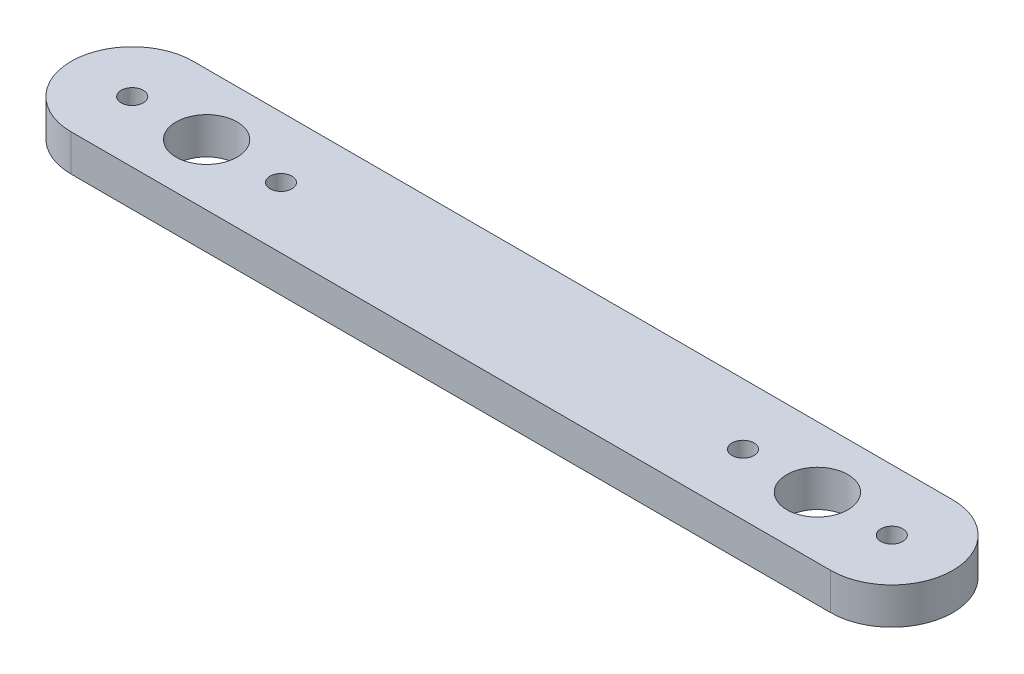
ISO-10303-21;
HEADER;
FILE_DESCRIPTION(('STEP AP214'),'2;1');
FILE_NAME('part.step','',(''),(''),'','','');
FILE_SCHEMA(('AUTOMOTIVE_DESIGN { 1 0 10303 214 1 1 1 1 }'));
ENDSEC;
DATA;
#1=APPLICATION_CONTEXT('core data for automotive mechanical design processes');
#2=APPLICATION_PROTOCOL_DEFINITION('international standard','automotive_design',2000,#1);
#3=PRODUCT_CONTEXT('',#1,'mechanical');
#4=PRODUCT('Part','Part','',(#3));
#5=PRODUCT_RELATED_PRODUCT_CATEGORY('part','',(#4));
#6=PRODUCT_DEFINITION_FORMATION('','',#4);
#7=PRODUCT_DEFINITION_CONTEXT('part definition',#1,'design');
#8=PRODUCT_DEFINITION('design','',#6,#7);
#9=PRODUCT_DEFINITION_SHAPE('','',#8);
#10=(LENGTH_UNIT() NAMED_UNIT(*) SI_UNIT(.MILLI.,.METRE.));
#11=(NAMED_UNIT(*) PLANE_ANGLE_UNIT() SI_UNIT($,.RADIAN.));
#12=(NAMED_UNIT(*) SI_UNIT($,.STERADIAN.) SOLID_ANGLE_UNIT());
#13=UNCERTAINTY_MEASURE_WITH_UNIT(LENGTH_MEASURE(1.E-05),#10,'distance_accuracy_value','');
#14=(GEOMETRIC_REPRESENTATION_CONTEXT(3) GLOBAL_UNCERTAINTY_ASSIGNED_CONTEXT((#13)) GLOBAL_UNIT_ASSIGNED_CONTEXT((#10,
#11,#12)) REPRESENTATION_CONTEXT('',''));
#15=CARTESIAN_POINT('',(0.,0.,0.));
#16=DIRECTION('',(0.,0.,1.));
#17=DIRECTION('',(1.,0.,0.));
#18=AXIS2_PLACEMENT_3D('',#15,#16,#17);
#19=CARTESIAN_POINT('',(-31.09,3.,0.));
#20=DIRECTION('',(0.,1.,0.));
#21=DIRECTION('',(0.,0.,1.));
#22=AXIS2_PLACEMENT_3D('',#19,#20,#21);
#23=PLANE('',#22);
#24=CARTESIAN_POINT('',(-31.09,3.,0.));
#25=DIRECTION('',(0.,1.,0.));
#26=DIRECTION('',(0.,0.,1.));
#27=AXIS2_PLACEMENT_3D('',#24,#25,#26);
#28=CIRCLE('',#27,0.9);
#29=CARTESIAN_POINT('',(-31.09,3.,0.900000000000001));
#30=VERTEX_POINT('',#29);
#31=EDGE_CURVE('E158',#30,#30,#28,.T.);
#32=ORIENTED_EDGE('',*,*,#31,.F.);
#33=EDGE_LOOP('',(#32));
#34=FACE_BOUND('',#33,.T.);
#35=CARTESIAN_POINT('',(-18.91,3.,0.));
#36=DIRECTION('',(0.,1.,0.));
#37=DIRECTION('',(0.,0.,1.));
#38=AXIS2_PLACEMENT_3D('',#35,#36,#37);
#39=CIRCLE('',#38,0.9);
#40=CARTESIAN_POINT('',(-18.91,3.,0.9));
#41=VERTEX_POINT('',#40);
#42=EDGE_CURVE('E142',#41,#41,#39,.T.);
#43=ORIENTED_EDGE('',*,*,#42,.F.);
#44=EDGE_LOOP('',(#43));
#45=FACE_BOUND('',#44,.T.);
#46=CARTESIAN_POINT('',(-25.,3.,0.));
#47=DIRECTION('',(0.,1.,0.));
#48=DIRECTION('',(0.,0.,1.));
#49=AXIS2_PLACEMENT_3D('',#46,#47,#48);
#50=CIRCLE('',#49,2.5);
#51=CARTESIAN_POINT('',(-25.,3.,2.5));
#52=VERTEX_POINT('',#51);
#53=EDGE_CURVE('E112',#52,#52,#50,.T.);
#54=ORIENTED_EDGE('',*,*,#53,.F.);
#55=EDGE_LOOP('',(#54));
#56=FACE_BOUND('',#55,.T.);
#57=CARTESIAN_POINT('',(-31.09,3.,0.));
#58=DIRECTION('',(0.,1.,0.));
#59=DIRECTION('',(0.,0.,1.));
#60=AXIS2_PLACEMENT_3D('',#57,#58,#59);
#61=CIRCLE('',#60,5.);
#62=CARTESIAN_POINT('',(-31.09,3.,-5.));
#63=VERTEX_POINT('',#62);
#64=CARTESIAN_POINT('',(-31.09,3.,5.));
#65=VERTEX_POINT('',#64);
#66=EDGE_CURVE('E92',#63,#65,#61,.T.);
#67=ORIENTED_EDGE('',*,*,#66,.T.);
#68=DIRECTION('',(1.,0.,0.));
#69=VECTOR('',#68,1.);
#70=CARTESIAN_POINT('',(-31.09,3.,5.));
#71=LINE('',#70,#69);
#72=CARTESIAN_POINT('',(31.09,3.,5.));
#73=VERTEX_POINT('',#72);
#74=EDGE_CURVE('E87',#65,#73,#71,.T.);
#75=ORIENTED_EDGE('',*,*,#74,.T.);
#76=CARTESIAN_POINT('',(31.09,3.,0.));
#77=DIRECTION('',(0.,1.,0.));
#78=DIRECTION('',(0.,0.,1.));
#79=AXIS2_PLACEMENT_3D('',#76,#77,#78);
#80=CIRCLE('',#79,5.);
#81=CARTESIAN_POINT('',(31.09,3.,-5.));
#82=VERTEX_POINT('',#81);
#83=EDGE_CURVE('E90',#73,#82,#80,.T.);
#84=ORIENTED_EDGE('',*,*,#83,.T.);
#85=DIRECTION('',(-1.,0.,0.));
#86=VECTOR('',#85,1.);
#87=CARTESIAN_POINT('',(-31.09,3.,-5.));
#88=LINE('',#87,#86);
#89=EDGE_CURVE('E57',#82,#63,#88,.T.);
#90=ORIENTED_EDGE('',*,*,#89,.T.);
#91=EDGE_LOOP('',(#67,#75,#84,#90));
#92=FACE_BOUND('',#91,.T.);
#93=CARTESIAN_POINT('',(25.,3.,0.));
#94=DIRECTION('',(0.,1.,0.));
#95=DIRECTION('',(0.,0.,1.));
#96=AXIS2_PLACEMENT_3D('',#93,#94,#95);
#97=CIRCLE('',#96,2.5);
#98=CARTESIAN_POINT('',(25.,3.,2.5));
#99=VERTEX_POINT('',#98);
#100=EDGE_CURVE('E134',#99,#99,#97,.T.);
#101=ORIENTED_EDGE('',*,*,#100,.F.);
#102=EDGE_LOOP('',(#101));
#103=FACE_BOUND('',#102,.T.);
#104=CARTESIAN_POINT('',(18.91,3.,0.));
#105=DIRECTION('',(0.,1.,0.));
#106=DIRECTION('',(0.,0.,1.));
#107=AXIS2_PLACEMENT_3D('',#104,#105,#106);
#108=CIRCLE('',#107,0.9);
#109=CARTESIAN_POINT('',(18.91,3.,0.9));
#110=VERTEX_POINT('',#109);
#111=EDGE_CURVE('E150',#110,#110,#108,.T.);
#112=ORIENTED_EDGE('',*,*,#111,.F.);
#113=EDGE_LOOP('',(#112));
#114=FACE_BOUND('',#113,.T.);
#115=CARTESIAN_POINT('',(31.09,3.,0.));
#116=DIRECTION('',(0.,1.,0.));
#117=DIRECTION('',(0.,0.,1.));
#118=AXIS2_PLACEMENT_3D('',#115,#116,#117);
#119=CIRCLE('',#118,0.899999999999997);
#120=CARTESIAN_POINT('',(31.09,3.,0.899999999999997));
#121=VERTEX_POINT('',#120);
#122=EDGE_CURVE('E166',#121,#121,#119,.T.);
#123=ORIENTED_EDGE('',*,*,#122,.F.);
#124=EDGE_LOOP('',(#123));
#125=FACE_BOUND('',#124,.T.);
#126=ADVANCED_FACE('F39',(#34,#45,#56,#92,#103,#114,#125),#23,.T.);
#127=CARTESIAN_POINT('',(-31.09,0.,0.));
#128=DIRECTION('',(0.,1.,0.));
#129=DIRECTION('',(0.,0.,1.));
#130=AXIS2_PLACEMENT_3D('',#127,#128,#129);
#131=PLANE('',#130);
#132=CARTESIAN_POINT('',(-31.09,0.,0.));
#133=DIRECTION('',(0.,1.,0.));
#134=DIRECTION('',(0.,0.,1.));
#135=AXIS2_PLACEMENT_3D('',#132,#133,#134);
#136=CIRCLE('',#135,5.);
#137=CARTESIAN_POINT('',(-31.09,0.,-5.));
#138=VERTEX_POINT('',#137);
#139=CARTESIAN_POINT('',(-31.09,0.,5.));
#140=VERTEX_POINT('',#139);
#141=EDGE_CURVE('E108',#138,#140,#136,.T.);
#142=ORIENTED_EDGE('',*,*,#141,.F.);
#143=DIRECTION('',(-1.,0.,0.));
#144=VECTOR('',#143,1.);
#145=CARTESIAN_POINT('',(-31.09,0.,-5.));
#146=LINE('',#145,#144);
#147=CARTESIAN_POINT('',(31.09,0.,-5.));
#148=VERTEX_POINT('',#147);
#149=EDGE_CURVE('E80',#148,#138,#146,.T.);
#150=ORIENTED_EDGE('',*,*,#149,.F.);
#151=CARTESIAN_POINT('',(31.09,0.,0.));
#152=DIRECTION('',(0.,1.,0.));
#153=DIRECTION('',(0.,0.,1.));
#154=AXIS2_PLACEMENT_3D('',#151,#152,#153);
#155=CIRCLE('',#154,5.);
#156=CARTESIAN_POINT('',(31.09,0.,5.));
#157=VERTEX_POINT('',#156);
#158=EDGE_CURVE('E74',#157,#148,#155,.T.);
#159=ORIENTED_EDGE('',*,*,#158,.F.);
#160=DIRECTION('',(1.,0.,0.));
#161=VECTOR('',#160,1.);
#162=CARTESIAN_POINT('',(-31.09,0.,5.));
#163=LINE('',#162,#161);
#164=EDGE_CURVE('E97',#140,#157,#163,.T.);
#165=ORIENTED_EDGE('',*,*,#164,.F.);
#166=EDGE_LOOP('',(#142,#150,#159,#165));
#167=FACE_BOUND('',#166,.T.);
#168=CARTESIAN_POINT('',(-25.,0.,0.));
#169=DIRECTION('',(0.,1.,0.));
#170=DIRECTION('',(0.,0.,1.));
#171=AXIS2_PLACEMENT_3D('',#168,#169,#170);
#172=CIRCLE('',#171,2.5);
#173=CARTESIAN_POINT('',(-25.,0.,2.5));
#174=VERTEX_POINT('',#173);
#175=EDGE_CURVE('E130',#174,#174,#172,.T.);
#176=ORIENTED_EDGE('',*,*,#175,.T.);
#177=EDGE_LOOP('',(#176));
#178=FACE_BOUND('',#177,.T.);
#179=CARTESIAN_POINT('',(25.,0.,0.));
#180=DIRECTION('',(0.,1.,0.));
#181=DIRECTION('',(0.,0.,1.));
#182=AXIS2_PLACEMENT_3D('',#179,#180,#181);
#183=CIRCLE('',#182,2.5);
#184=CARTESIAN_POINT('',(25.,0.,2.5));
#185=VERTEX_POINT('',#184);
#186=EDGE_CURVE('E138',#185,#185,#183,.T.);
#187=ORIENTED_EDGE('',*,*,#186,.T.);
#188=EDGE_LOOP('',(#187));
#189=FACE_BOUND('',#188,.T.);
#190=CARTESIAN_POINT('',(-18.91,0.,0.));
#191=DIRECTION('',(0.,1.,0.));
#192=DIRECTION('',(0.,0.,1.));
#193=AXIS2_PLACEMENT_3D('',#190,#191,#192);
#194=CIRCLE('',#193,0.9);
#195=CARTESIAN_POINT('',(-18.91,0.,0.9));
#196=VERTEX_POINT('',#195);
#197=EDGE_CURVE('E146',#196,#196,#194,.T.);
#198=ORIENTED_EDGE('',*,*,#197,.T.);
#199=EDGE_LOOP('',(#198));
#200=FACE_BOUND('',#199,.T.);
#201=CARTESIAN_POINT('',(18.91,0.,0.));
#202=DIRECTION('',(0.,1.,0.));
#203=DIRECTION('',(0.,0.,1.));
#204=AXIS2_PLACEMENT_3D('',#201,#202,#203);
#205=CIRCLE('',#204,0.9);
#206=CARTESIAN_POINT('',(18.91,0.,0.9));
#207=VERTEX_POINT('',#206);
#208=EDGE_CURVE('E154',#207,#207,#205,.T.);
#209=ORIENTED_EDGE('',*,*,#208,.T.);
#210=EDGE_LOOP('',(#209));
#211=FACE_BOUND('',#210,.T.);
#212=CARTESIAN_POINT('',(-31.09,0.,0.));
#213=DIRECTION('',(0.,1.,0.));
#214=DIRECTION('',(0.,0.,1.));
#215=AXIS2_PLACEMENT_3D('',#212,#213,#214);
#216=CIRCLE('',#215,0.9);
#217=CARTESIAN_POINT('',(-31.09,0.,0.900000000000001));
#218=VERTEX_POINT('',#217);
#219=EDGE_CURVE('E162',#218,#218,#216,.T.);
#220=ORIENTED_EDGE('',*,*,#219,.T.);
#221=EDGE_LOOP('',(#220));
#222=FACE_BOUND('',#221,.T.);
#223=CARTESIAN_POINT('',(31.09,0.,0.));
#224=DIRECTION('',(0.,1.,0.));
#225=DIRECTION('',(0.,0.,1.));
#226=AXIS2_PLACEMENT_3D('',#223,#224,#225);
#227=CIRCLE('',#226,0.899999999999997);
#228=CARTESIAN_POINT('',(31.09,0.,0.899999999999997));
#229=VERTEX_POINT('',#228);
#230=EDGE_CURVE('E170',#229,#229,#227,.T.);
#231=ORIENTED_EDGE('',*,*,#230,.T.);
#232=EDGE_LOOP('',(#231));
#233=FACE_BOUND('',#232,.T.);
#234=ADVANCED_FACE('F125',(#167,#178,#189,#200,#211,#222,#233),#131,.F.);
#235=CARTESIAN_POINT('',(-31.09,3.,0.));
#236=DIRECTION('',(0.,-1.,0.));
#237=DIRECTION('',(0.,0.,-1.));
#238=AXIS2_PLACEMENT_3D('',#235,#236,#237);
#239=CYLINDRICAL_SURFACE('',#238,5.);
#240=ORIENTED_EDGE('',*,*,#141,.T.);
#241=DIRECTION('',(0.,-1.,0.));
#242=VECTOR('',#241,1.);
#243=CARTESIAN_POINT('',(-31.09,3.,5.));
#244=LINE('',#243,#242);
#245=EDGE_CURVE('E11',#65,#140,#244,.T.);
#246=ORIENTED_EDGE('',*,*,#245,.F.);
#247=ORIENTED_EDGE('',*,*,#66,.F.);
#248=DIRECTION('',(0.,-1.,0.));
#249=VECTOR('',#248,1.);
#250=CARTESIAN_POINT('',(-31.09,3.,-5.));
#251=LINE('',#250,#249);
#252=EDGE_CURVE('E104',#63,#138,#251,.T.);
#253=ORIENTED_EDGE('',*,*,#252,.T.);
#254=EDGE_LOOP('',(#240,#246,#247,#253));
#255=FACE_BOUND('',#254,.T.);
#256=ADVANCED_FACE('F41',(#255),#239,.T.);
#257=CARTESIAN_POINT('',(-31.09,3.,5.));
#258=DIRECTION('',(0.,0.,-1.));
#259=DIRECTION('',(-1.,0.,0.));
#260=AXIS2_PLACEMENT_3D('',#257,#258,#259);
#261=PLANE('',#260);
#262=ORIENTED_EDGE('',*,*,#164,.T.);
#263=DIRECTION('',(0.,-1.,0.));
#264=VECTOR('',#263,1.);
#265=CARTESIAN_POINT('',(31.09,3.,5.));
#266=LINE('',#265,#264);
#267=EDGE_CURVE('E49',#73,#157,#266,.T.);
#268=ORIENTED_EDGE('',*,*,#267,.F.);
#269=ORIENTED_EDGE('',*,*,#74,.F.);
#270=ORIENTED_EDGE('',*,*,#245,.T.);
#271=EDGE_LOOP('',(#262,#268,#269,#270));
#272=FACE_BOUND('',#271,.T.);
#273=ADVANCED_FACE('F96',(#272),#261,.F.);
#274=CARTESIAN_POINT('',(31.09,3.,0.));
#275=DIRECTION('',(0.,-1.,0.));
#276=DIRECTION('',(0.,0.,-1.));
#277=AXIS2_PLACEMENT_3D('',#274,#275,#276);
#278=CYLINDRICAL_SURFACE('',#277,5.);
#279=ORIENTED_EDGE('',*,*,#158,.T.);
#280=DIRECTION('',(0.,-1.,0.));
#281=VECTOR('',#280,1.);
#282=CARTESIAN_POINT('',(31.09,3.,-5.));
#283=LINE('',#282,#281);
#284=EDGE_CURVE('E99',#82,#148,#283,.T.);
#285=ORIENTED_EDGE('',*,*,#284,.F.);
#286=ORIENTED_EDGE('',*,*,#83,.F.);
#287=ORIENTED_EDGE('',*,*,#267,.T.);
#288=EDGE_LOOP('',(#279,#285,#286,#287));
#289=FACE_BOUND('',#288,.T.);
#290=ADVANCED_FACE('F100',(#289),#278,.T.);
#291=CARTESIAN_POINT('',(-31.09,3.,-5.));
#292=DIRECTION('',(0.,0.,1.));
#293=DIRECTION('',(1.,0.,0.));
#294=AXIS2_PLACEMENT_3D('',#291,#292,#293);
#295=PLANE('',#294);
#296=ORIENTED_EDGE('',*,*,#149,.T.);
#297=ORIENTED_EDGE('',*,*,#252,.F.);
#298=ORIENTED_EDGE('',*,*,#89,.F.);
#299=ORIENTED_EDGE('',*,*,#284,.T.);
#300=EDGE_LOOP('',(#296,#297,#298,#299));
#301=FACE_BOUND('',#300,.T.);
#302=ADVANCED_FACE('F122',(#301),#295,.F.);
#303=CARTESIAN_POINT('',(-25.,3.,0.));
#304=DIRECTION('',(0.,-1.,0.));
#305=DIRECTION('',(0.,0.,-1.));
#306=AXIS2_PLACEMENT_3D('',#303,#304,#305);
#307=CYLINDRICAL_SURFACE('',#306,2.5);
#308=ORIENTED_EDGE('',*,*,#53,.T.);
#309=EDGE_LOOP('',(#308));
#310=FACE_BOUND('',#309,.T.);
#311=ORIENTED_EDGE('',*,*,#175,.F.);
#312=EDGE_LOOP('',(#311));
#313=FACE_BOUND('',#312,.T.);
#314=ADVANCED_FACE('F191',(#310,#313),#307,.F.);
#315=CARTESIAN_POINT('',(25.,3.,0.));
#316=DIRECTION('',(0.,-1.,0.));
#317=DIRECTION('',(0.,0.,-1.));
#318=AXIS2_PLACEMENT_3D('',#315,#316,#317);
#319=CYLINDRICAL_SURFACE('',#318,2.5);
#320=ORIENTED_EDGE('',*,*,#100,.T.);
#321=EDGE_LOOP('',(#320));
#322=FACE_BOUND('',#321,.T.);
#323=ORIENTED_EDGE('',*,*,#186,.F.);
#324=EDGE_LOOP('',(#323));
#325=FACE_BOUND('',#324,.T.);
#326=ADVANCED_FACE('F237',(#322,#325),#319,.F.);
#327=CARTESIAN_POINT('',(-18.91,3.,0.));
#328=DIRECTION('',(0.,-1.,0.));
#329=DIRECTION('',(0.,0.,-1.));
#330=AXIS2_PLACEMENT_3D('',#327,#328,#329);
#331=CYLINDRICAL_SURFACE('',#330,0.9);
#332=ORIENTED_EDGE('',*,*,#42,.T.);
#333=EDGE_LOOP('',(#332));
#334=FACE_BOUND('',#333,.T.);
#335=ORIENTED_EDGE('',*,*,#197,.F.);
#336=EDGE_LOOP('',(#335));
#337=FACE_BOUND('',#336,.T.);
#338=ADVANCED_FACE('F245',(#334,#337),#331,.F.);
#339=CARTESIAN_POINT('',(18.91,3.,0.));
#340=DIRECTION('',(0.,-1.,0.));
#341=DIRECTION('',(0.,0.,-1.));
#342=AXIS2_PLACEMENT_3D('',#339,#340,#341);
#343=CYLINDRICAL_SURFACE('',#342,0.9);
#344=ORIENTED_EDGE('',*,*,#111,.T.);
#345=EDGE_LOOP('',(#344));
#346=FACE_BOUND('',#345,.T.);
#347=ORIENTED_EDGE('',*,*,#208,.F.);
#348=EDGE_LOOP('',(#347));
#349=FACE_BOUND('',#348,.T.);
#350=ADVANCED_FACE('F253',(#346,#349),#343,.F.);
#351=CARTESIAN_POINT('',(-31.09,3.,0.));
#352=DIRECTION('',(0.,-1.,0.));
#353=DIRECTION('',(0.,0.,-1.));
#354=AXIS2_PLACEMENT_3D('',#351,#352,#353);
#355=CYLINDRICAL_SURFACE('',#354,0.9);
#356=ORIENTED_EDGE('',*,*,#31,.T.);
#357=EDGE_LOOP('',(#356));
#358=FACE_BOUND('',#357,.T.);
#359=ORIENTED_EDGE('',*,*,#219,.F.);
#360=EDGE_LOOP('',(#359));
#361=FACE_BOUND('',#360,.T.);
#362=ADVANCED_FACE('F262',(#358,#361),#355,.F.);
#363=CARTESIAN_POINT('',(31.09,3.,0.));
#364=DIRECTION('',(0.,-1.,0.));
#365=DIRECTION('',(0.,0.,-1.));
#366=AXIS2_PLACEMENT_3D('',#363,#364,#365);
#367=CYLINDRICAL_SURFACE('',#366,0.899999999999997);
#368=ORIENTED_EDGE('',*,*,#122,.T.);
#369=EDGE_LOOP('',(#368));
#370=FACE_BOUND('',#369,.T.);
#371=ORIENTED_EDGE('',*,*,#230,.F.);
#372=EDGE_LOOP('',(#371));
#373=FACE_BOUND('',#372,.T.);
#374=ADVANCED_FACE('F178',(#370,#373),#367,.F.);
#375=CLOSED_SHELL('',(#126,#234,#256,#273,#290,#302,#314,#326,#338,#350,#362,#374));
#376=MANIFOLD_SOLID_BREP('B2',#375);
#377=ADVANCED_BREP_SHAPE_REPRESENTATION('',(#18,#376),#14);
#378=SHAPE_DEFINITION_REPRESENTATION(#9,#377);
ENDSEC;
END-ISO-10303-21;
